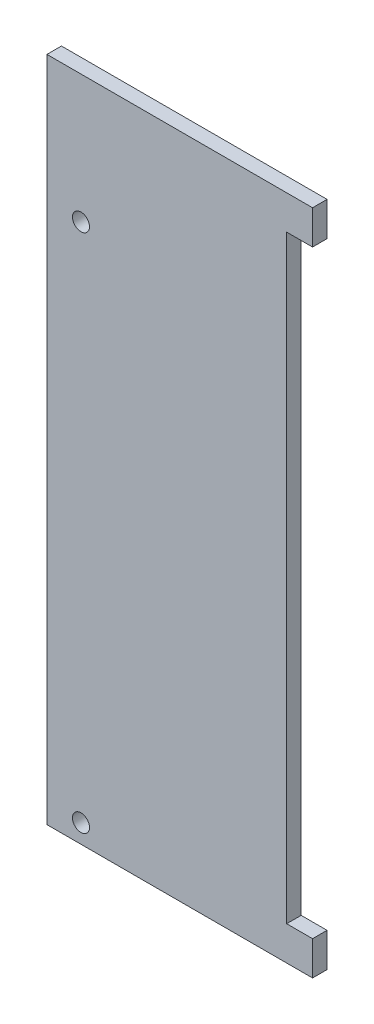
ISO-10303-21;
HEADER;
FILE_DESCRIPTION(('STEP AP214'),'2;1');
FILE_NAME('part.step','',(''),(''),'','','');
FILE_SCHEMA(('AUTOMOTIVE_DESIGN { 1 0 10303 214 1 1 1 1 }'));
ENDSEC;
DATA;
#1=APPLICATION_CONTEXT('core data for automotive mechanical design processes');
#2=APPLICATION_PROTOCOL_DEFINITION('international standard','automotive_design',2000,#1);
#3=PRODUCT_CONTEXT('',#1,'mechanical');
#4=PRODUCT('Part','Part','',(#3));
#5=PRODUCT_RELATED_PRODUCT_CATEGORY('part','',(#4));
#6=PRODUCT_DEFINITION_FORMATION('','',#4);
#7=PRODUCT_DEFINITION_CONTEXT('part definition',#1,'design');
#8=PRODUCT_DEFINITION('design','',#6,#7);
#9=PRODUCT_DEFINITION_SHAPE('','',#8);
#10=(LENGTH_UNIT() NAMED_UNIT(*) SI_UNIT(.MILLI.,.METRE.));
#11=(NAMED_UNIT(*) PLANE_ANGLE_UNIT() SI_UNIT($,.RADIAN.));
#12=(NAMED_UNIT(*) SI_UNIT($,.STERADIAN.) SOLID_ANGLE_UNIT());
#13=UNCERTAINTY_MEASURE_WITH_UNIT(LENGTH_MEASURE(1.E-05),#10,'distance_accuracy_value','');
#14=(GEOMETRIC_REPRESENTATION_CONTEXT(3) GLOBAL_UNCERTAINTY_ASSIGNED_CONTEXT((#13)) GLOBAL_UNIT_ASSIGNED_CONTEXT((#10,
#11,#12)) REPRESENTATION_CONTEXT('',''));
#15=CARTESIAN_POINT('',(0.,0.,0.));
#16=DIRECTION('',(0.,0.,1.));
#17=DIRECTION('',(1.,0.,0.));
#18=AXIS2_PLACEMENT_3D('',#15,#16,#17);
#19=CARTESIAN_POINT('',(1.60587917232952E-13,-111.68888,5.4102));
#20=DIRECTION('',(0.,1.,0.));
#21=DIRECTION('',(-1.,0.,0.));
#22=AXIS2_PLACEMENT_3D('',#19,#20,#21);
#23=PLANE('',#22);
#24=DIRECTION('',(1.,0.,0.));
#25=VECTOR('',#24,1.);
#26=CARTESIAN_POINT('',(1.60587917232952E-13,-111.68888,0.));
#27=LINE('',#26,#25);
#28=CARTESIAN_POINT('',(39.878,-111.68888,0.));
#29=VERTEX_POINT('',#28);
#30=CARTESIAN_POINT('',(49.53,-111.68888,0.));
#31=VERTEX_POINT('',#30);
#32=EDGE_CURVE('E136',#29,#31,#27,.T.);
#33=ORIENTED_EDGE('',*,*,#32,.F.);
#34=DIRECTION('',(0.,0.,-1.));
#35=VECTOR('',#34,1.);
#36=CARTESIAN_POINT('',(39.878,-111.68888,5.4102));
#37=LINE('',#36,#35);
#38=CARTESIAN_POINT('',(39.878,-111.68888,5.4102));
#39=VERTEX_POINT('',#38);
#40=EDGE_CURVE('E11',#39,#29,#37,.T.);
#41=ORIENTED_EDGE('',*,*,#40,.F.);
#42=DIRECTION('',(1.,0.,0.));
#43=VECTOR('',#42,1.);
#44=CARTESIAN_POINT('',(1.60587917232952E-13,-111.68888,5.4102));
#45=LINE('',#44,#43);
#46=CARTESIAN_POINT('',(49.53,-111.68888,5.4102));
#47=VERTEX_POINT('',#46);
#48=EDGE_CURVE('E179',#39,#47,#45,.T.);
#49=ORIENTED_EDGE('',*,*,#48,.T.);
#50=DIRECTION('',(0.,0.,-1.));
#51=VECTOR('',#50,1.);
#52=CARTESIAN_POINT('',(49.53,-111.68888,5.4102));
#53=LINE('',#52,#51);
#54=EDGE_CURVE('E86',#47,#31,#53,.T.);
#55=ORIENTED_EDGE('',*,*,#54,.T.);
#56=EDGE_LOOP('',(#33,#41,#49,#55));
#57=FACE_BOUND('',#56,.T.);
#58=ADVANCED_FACE('F34',(#57),#23,.T.);
#59=CARTESIAN_POINT('',(39.878,0.,5.4102));
#60=DIRECTION('',(1.,0.,0.));
#61=DIRECTION('',(0.,1.,0.));
#62=AXIS2_PLACEMENT_3D('',#59,#60,#61);
#63=PLANE('',#62);
#64=DIRECTION('',(0.,-1.,0.));
#65=VECTOR('',#64,1.);
#66=CARTESIAN_POINT('',(39.878,0.,0.));
#67=LINE('',#66,#65);
#68=CARTESIAN_POINT('',(39.878,111.68888,0.));
#69=VERTEX_POINT('',#68);
#70=EDGE_CURVE('E138',#69,#29,#67,.T.);
#71=ORIENTED_EDGE('',*,*,#70,.F.);
#72=DIRECTION('',(0.,0.,-1.));
#73=VECTOR('',#72,1.);
#74=CARTESIAN_POINT('',(39.878,111.68888,5.4102));
#75=LINE('',#74,#73);
#76=CARTESIAN_POINT('',(39.878,111.68888,5.4102));
#77=VERTEX_POINT('',#76);
#78=EDGE_CURVE('E43',#77,#69,#75,.T.);
#79=ORIENTED_EDGE('',*,*,#78,.F.);
#80=DIRECTION('',(0.,-1.,0.));
#81=VECTOR('',#80,1.);
#82=CARTESIAN_POINT('',(39.878,0.,5.4102));
#83=LINE('',#82,#81);
#84=EDGE_CURVE('E177',#77,#39,#83,.T.);
#85=ORIENTED_EDGE('',*,*,#84,.T.);
#86=ORIENTED_EDGE('',*,*,#40,.T.);
#87=EDGE_LOOP('',(#71,#79,#85,#86));
#88=FACE_BOUND('',#87,.T.);
#89=ADVANCED_FACE('F169',(#88),#63,.T.);
#90=CARTESIAN_POINT('',(1.60587917232952E-13,111.68888,5.4102));
#91=DIRECTION('',(0.,-1.,0.));
#92=DIRECTION('',(1.,0.,0.));
#93=AXIS2_PLACEMENT_3D('',#90,#91,#92);
#94=PLANE('',#93);
#95=DIRECTION('',(-1.,0.,0.));
#96=VECTOR('',#95,1.);
#97=CARTESIAN_POINT('',(1.60587917232952E-13,111.68888,0.));
#98=LINE('',#97,#96);
#99=CARTESIAN_POINT('',(49.53,111.68888,0.));
#100=VERTEX_POINT('',#99);
#101=EDGE_CURVE('E141',#100,#69,#98,.T.);
#102=ORIENTED_EDGE('',*,*,#101,.F.);
#103=DIRECTION('',(0.,0.,-1.));
#104=VECTOR('',#103,1.);
#105=CARTESIAN_POINT('',(49.53,111.68888,5.4102));
#106=LINE('',#105,#104);
#107=CARTESIAN_POINT('',(49.53,111.68888,5.4102));
#108=VERTEX_POINT('',#107);
#109=EDGE_CURVE('E158',#108,#100,#106,.T.);
#110=ORIENTED_EDGE('',*,*,#109,.F.);
#111=DIRECTION('',(-1.,0.,0.));
#112=VECTOR('',#111,1.);
#113=CARTESIAN_POINT('',(1.60587917232952E-13,111.68888,5.4102));
#114=LINE('',#113,#112);
#115=EDGE_CURVE('E165',#108,#77,#114,.T.);
#116=ORIENTED_EDGE('',*,*,#115,.T.);
#117=ORIENTED_EDGE('',*,*,#78,.T.);
#118=EDGE_LOOP('',(#102,#110,#116,#117));
#119=FACE_BOUND('',#118,.T.);
#120=ADVANCED_FACE('F163',(#119),#94,.T.);
#121=CARTESIAN_POINT('',(49.53,0.,5.4102));
#122=DIRECTION('',(-1.,0.,0.));
#123=DIRECTION('',(0.,0.,1.));
#124=AXIS2_PLACEMENT_3D('',#121,#122,#123);
#125=PLANE('',#124);
#126=DIRECTION('',(0.,1.,0.));
#127=VECTOR('',#126,1.);
#128=CARTESIAN_POINT('',(49.53,0.,0.));
#129=LINE('',#128,#127);
#130=CARTESIAN_POINT('',(49.53,124.38888,0.));
#131=VERTEX_POINT('',#130);
#132=EDGE_CURVE('E144',#100,#131,#129,.T.);
#133=ORIENTED_EDGE('',*,*,#132,.T.);
#134=DIRECTION('',(0.,0.,-1.));
#135=VECTOR('',#134,1.);
#136=CARTESIAN_POINT('',(49.53,124.38888,5.4102));
#137=LINE('',#136,#135);
#138=CARTESIAN_POINT('',(49.53,124.38888,5.4102));
#139=VERTEX_POINT('',#138);
#140=EDGE_CURVE('E156',#139,#131,#137,.T.);
#141=ORIENTED_EDGE('',*,*,#140,.F.);
#142=DIRECTION('',(0.,1.,0.));
#143=VECTOR('',#142,1.);
#144=CARTESIAN_POINT('',(49.53,0.,5.4102));
#145=LINE('',#144,#143);
#146=EDGE_CURVE('E126',#108,#139,#145,.T.);
#147=ORIENTED_EDGE('',*,*,#146,.F.);
#148=ORIENTED_EDGE('',*,*,#109,.T.);
#149=EDGE_LOOP('',(#133,#141,#147,#148));
#150=FACE_BOUND('',#149,.T.);
#151=ADVANCED_FACE('F175',(#150),#125,.F.);
#152=CARTESIAN_POINT('',(0.,124.38888,5.4102));
#153=DIRECTION('',(0.,1.,0.));
#154=DIRECTION('',(0.,0.,1.));
#155=AXIS2_PLACEMENT_3D('',#152,#153,#154);
#156=PLANE('',#155);
#157=DIRECTION('',(1.,0.,0.));
#158=VECTOR('',#157,1.);
#159=CARTESIAN_POINT('',(0.,124.38888,0.));
#160=LINE('',#159,#158);
#161=CARTESIAN_POINT('',(-49.53,124.38888,0.));
#162=VERTEX_POINT('',#161);
#163=EDGE_CURVE('E147',#162,#131,#160,.T.);
#164=ORIENTED_EDGE('',*,*,#163,.F.);
#165=DIRECTION('',(0.,0.,-1.));
#166=VECTOR('',#165,1.);
#167=CARTESIAN_POINT('',(-49.53,124.38888,5.4102));
#168=LINE('',#167,#166);
#169=CARTESIAN_POINT('',(-49.53,124.38888,5.4102));
#170=VERTEX_POINT('',#169);
#171=EDGE_CURVE('E114',#170,#162,#168,.T.);
#172=ORIENTED_EDGE('',*,*,#171,.F.);
#173=DIRECTION('',(1.,0.,0.));
#174=VECTOR('',#173,1.);
#175=CARTESIAN_POINT('',(0.,124.38888,5.4102));
#176=LINE('',#175,#174);
#177=EDGE_CURVE('E124',#170,#139,#176,.T.);
#178=ORIENTED_EDGE('',*,*,#177,.T.);
#179=ORIENTED_EDGE('',*,*,#140,.T.);
#180=EDGE_LOOP('',(#164,#172,#178,#179));
#181=FACE_BOUND('',#180,.T.);
#182=ADVANCED_FACE('F224',(#181),#156,.T.);
#183=CARTESIAN_POINT('',(-49.53,0.,5.4102));
#184=DIRECTION('',(-1.,0.,0.));
#185=DIRECTION('',(0.,0.,1.));
#186=AXIS2_PLACEMENT_3D('',#183,#184,#185);
#187=PLANE('',#186);
#188=DIRECTION('',(0.,1.,0.));
#189=VECTOR('',#188,1.);
#190=CARTESIAN_POINT('',(-49.53,0.,0.));
#191=LINE('',#190,#189);
#192=CARTESIAN_POINT('',(-49.53,-124.38888,0.));
#193=VERTEX_POINT('',#192);
#194=EDGE_CURVE('E111',#193,#162,#191,.T.);
#195=ORIENTED_EDGE('',*,*,#194,.F.);
#196=DIRECTION('',(0.,0.,-1.));
#197=VECTOR('',#196,1.);
#198=CARTESIAN_POINT('',(-49.53,-124.38888,5.4102));
#199=LINE('',#198,#197);
#200=CARTESIAN_POINT('',(-49.53,-124.38888,5.4102));
#201=VERTEX_POINT('',#200);
#202=EDGE_CURVE('E105',#201,#193,#199,.T.);
#203=ORIENTED_EDGE('',*,*,#202,.F.);
#204=DIRECTION('',(0.,1.,0.));
#205=VECTOR('',#204,1.);
#206=CARTESIAN_POINT('',(-49.53,0.,5.4102));
#207=LINE('',#206,#205);
#208=EDGE_CURVE('E109',#201,#170,#207,.T.);
#209=ORIENTED_EDGE('',*,*,#208,.T.);
#210=ORIENTED_EDGE('',*,*,#171,.T.);
#211=EDGE_LOOP('',(#195,#203,#209,#210));
#212=FACE_BOUND('',#211,.T.);
#213=ADVANCED_FACE('F107',(#212),#187,.T.);
#214=CARTESIAN_POINT('',(0.,-124.38888,5.4102));
#215=DIRECTION('',(0.,1.,0.));
#216=DIRECTION('',(0.,0.,1.));
#217=AXIS2_PLACEMENT_3D('',#214,#215,#216);
#218=PLANE('',#217);
#219=DIRECTION('',(1.,0.,0.));
#220=VECTOR('',#219,1.);
#221=CARTESIAN_POINT('',(0.,-124.38888,0.));
#222=LINE('',#221,#220);
#223=CARTESIAN_POINT('',(49.53,-124.38888,0.));
#224=VERTEX_POINT('',#223);
#225=EDGE_CURVE('E151',#193,#224,#222,.T.);
#226=ORIENTED_EDGE('',*,*,#225,.T.);
#227=DIRECTION('',(0.,0.,-1.));
#228=VECTOR('',#227,1.);
#229=CARTESIAN_POINT('',(49.53,-124.38888,5.4102));
#230=LINE('',#229,#228);
#231=CARTESIAN_POINT('',(49.53,-124.38888,5.4102));
#232=VERTEX_POINT('',#231);
#233=EDGE_CURVE('E115',#232,#224,#230,.T.);
#234=ORIENTED_EDGE('',*,*,#233,.F.);
#235=DIRECTION('',(1.,0.,0.));
#236=VECTOR('',#235,1.);
#237=CARTESIAN_POINT('',(0.,-124.38888,5.4102));
#238=LINE('',#237,#236);
#239=EDGE_CURVE('E118',#201,#232,#238,.T.);
#240=ORIENTED_EDGE('',*,*,#239,.F.);
#241=ORIENTED_EDGE('',*,*,#202,.T.);
#242=EDGE_LOOP('',(#226,#234,#240,#241));
#243=FACE_BOUND('',#242,.T.);
#244=ADVANCED_FACE('F119',(#243),#218,.F.);
#245=CARTESIAN_POINT('',(-36.83,-117.40388,5.4102));
#246=DIRECTION('',(0.,0.,-1.));
#247=DIRECTION('',(-1.,0.,0.));
#248=AXIS2_PLACEMENT_3D('',#245,#246,#247);
#249=CYLINDRICAL_SURFACE('',#248,3.175);
#250=CARTESIAN_POINT('',(-36.83,-117.40388,5.4102));
#251=DIRECTION('',(0.,0.,1.));
#252=DIRECTION('',(1.,0.,0.));
#253=AXIS2_PLACEMENT_3D('',#250,#251,#252);
#254=CIRCLE('',#253,3.175);
#255=CARTESIAN_POINT('',(-33.655,-117.40388,5.4102));
#256=VERTEX_POINT('',#255);
#257=EDGE_CURVE('E183',#256,#256,#254,.T.);
#258=ORIENTED_EDGE('',*,*,#257,.T.);
#259=EDGE_LOOP('',(#258));
#260=FACE_BOUND('',#259,.T.);
#261=CARTESIAN_POINT('',(-36.83,-117.40388,0.));
#262=DIRECTION('',(0.,0.,1.));
#263=DIRECTION('',(1.,0.,0.));
#264=AXIS2_PLACEMENT_3D('',#261,#262,#263);
#265=CIRCLE('',#264,3.175);
#266=CARTESIAN_POINT('',(-33.655,-117.40388,0.));
#267=VERTEX_POINT('',#266);
#268=EDGE_CURVE('E133',#267,#267,#265,.T.);
#269=ORIENTED_EDGE('',*,*,#268,.F.);
#270=EDGE_LOOP('',(#269));
#271=FACE_BOUND('',#270,.T.);
#272=ADVANCED_FACE('F199',(#260,#271),#249,.F.);
#273=CARTESIAN_POINT('',(-36.83,76.63688,5.4102));
#274=DIRECTION('',(0.,0.,-1.));
#275=DIRECTION('',(-1.,0.,0.));
#276=AXIS2_PLACEMENT_3D('',#273,#274,#275);
#277=CYLINDRICAL_SURFACE('',#276,3.175);
#278=CARTESIAN_POINT('',(-36.83,76.63688,5.4102));
#279=DIRECTION('',(0.,0.,1.));
#280=DIRECTION('',(1.,0.,0.));
#281=AXIS2_PLACEMENT_3D('',#278,#279,#280);
#282=CIRCLE('',#281,3.175);
#283=CARTESIAN_POINT('',(-33.655,76.63688,5.4102));
#284=VERTEX_POINT('',#283);
#285=EDGE_CURVE('E186',#284,#284,#282,.T.);
#286=ORIENTED_EDGE('',*,*,#285,.T.);
#287=EDGE_LOOP('',(#286));
#288=FACE_BOUND('',#287,.T.);
#289=CARTESIAN_POINT('',(-36.83,76.63688,0.));
#290=DIRECTION('',(0.,0.,1.));
#291=DIRECTION('',(1.,0.,0.));
#292=AXIS2_PLACEMENT_3D('',#289,#290,#291);
#293=CIRCLE('',#292,3.175);
#294=CARTESIAN_POINT('',(-33.655,76.63688,0.));
#295=VERTEX_POINT('',#294);
#296=EDGE_CURVE('E130',#295,#295,#293,.T.);
#297=ORIENTED_EDGE('',*,*,#296,.F.);
#298=EDGE_LOOP('',(#297));
#299=FACE_BOUND('',#298,.T.);
#300=ADVANCED_FACE('F36',(#288,#299),#277,.F.);
#301=EDGE_CURVE('E79',#224,#31,#129,.T.);
#302=ORIENTED_EDGE('',*,*,#301,.T.);
#303=ORIENTED_EDGE('',*,*,#54,.F.);
#304=EDGE_CURVE('E51',#232,#47,#145,.T.);
#305=ORIENTED_EDGE('',*,*,#304,.F.);
#306=ORIENTED_EDGE('',*,*,#233,.T.);
#307=EDGE_LOOP('',(#302,#303,#305,#306));
#308=FACE_BOUND('',#307,.T.);
#309=ADVANCED_FACE('F191',(#308),#125,.F.);
#310=CARTESIAN_POINT('',(0.,0.,5.4102));
#311=DIRECTION('',(0.,0.,1.));
#312=DIRECTION('',(1.,0.,0.));
#313=AXIS2_PLACEMENT_3D('',#310,#311,#312);
#314=PLANE('',#313);
#315=ORIENTED_EDGE('',*,*,#285,.F.);
#316=EDGE_LOOP('',(#315));
#317=FACE_BOUND('',#316,.T.);
#318=ORIENTED_EDGE('',*,*,#257,.F.);
#319=EDGE_LOOP('',(#318));
#320=FACE_BOUND('',#319,.T.);
#321=ORIENTED_EDGE('',*,*,#48,.F.);
#322=ORIENTED_EDGE('',*,*,#84,.F.);
#323=ORIENTED_EDGE('',*,*,#115,.F.);
#324=ORIENTED_EDGE('',*,*,#146,.T.);
#325=ORIENTED_EDGE('',*,*,#177,.F.);
#326=ORIENTED_EDGE('',*,*,#208,.F.);
#327=ORIENTED_EDGE('',*,*,#239,.T.);
#328=ORIENTED_EDGE('',*,*,#304,.T.);
#329=EDGE_LOOP('',(#321,#322,#323,#324,#325,#326,#327,#328));
#330=FACE_BOUND('',#329,.T.);
#331=ADVANCED_FACE('F122',(#317,#320,#330),#314,.T.);
#332=CARTESIAN_POINT('',(0.,0.,0.));
#333=DIRECTION('',(0.,0.,1.));
#334=DIRECTION('',(1.,0.,0.));
#335=AXIS2_PLACEMENT_3D('',#332,#333,#334);
#336=PLANE('',#335);
#337=ORIENTED_EDGE('',*,*,#296,.T.);
#338=EDGE_LOOP('',(#337));
#339=FACE_BOUND('',#338,.T.);
#340=ORIENTED_EDGE('',*,*,#268,.T.);
#341=EDGE_LOOP('',(#340));
#342=FACE_BOUND('',#341,.T.);
#343=ORIENTED_EDGE('',*,*,#32,.T.);
#344=ORIENTED_EDGE('',*,*,#301,.F.);
#345=ORIENTED_EDGE('',*,*,#225,.F.);
#346=ORIENTED_EDGE('',*,*,#194,.T.);
#347=ORIENTED_EDGE('',*,*,#163,.T.);
#348=ORIENTED_EDGE('',*,*,#132,.F.);
#349=ORIENTED_EDGE('',*,*,#101,.T.);
#350=ORIENTED_EDGE('',*,*,#70,.T.);
#351=EDGE_LOOP('',(#343,#344,#345,#346,#347,#348,#349,#350));
#352=FACE_BOUND('',#351,.T.);
#353=ADVANCED_FACE('F171',(#339,#342,#352),#336,.F.);
#354=CLOSED_SHELL('',(#58,#89,#120,#151,#182,#213,#244,#272,#300,#309,#331,#353));
#355=MANIFOLD_SOLID_BREP('B2',#354);
#356=ADVANCED_BREP_SHAPE_REPRESENTATION('',(#18,#355),#14);
#357=SHAPE_DEFINITION_REPRESENTATION(#9,#356);
ENDSEC;
END-ISO-10303-21;
